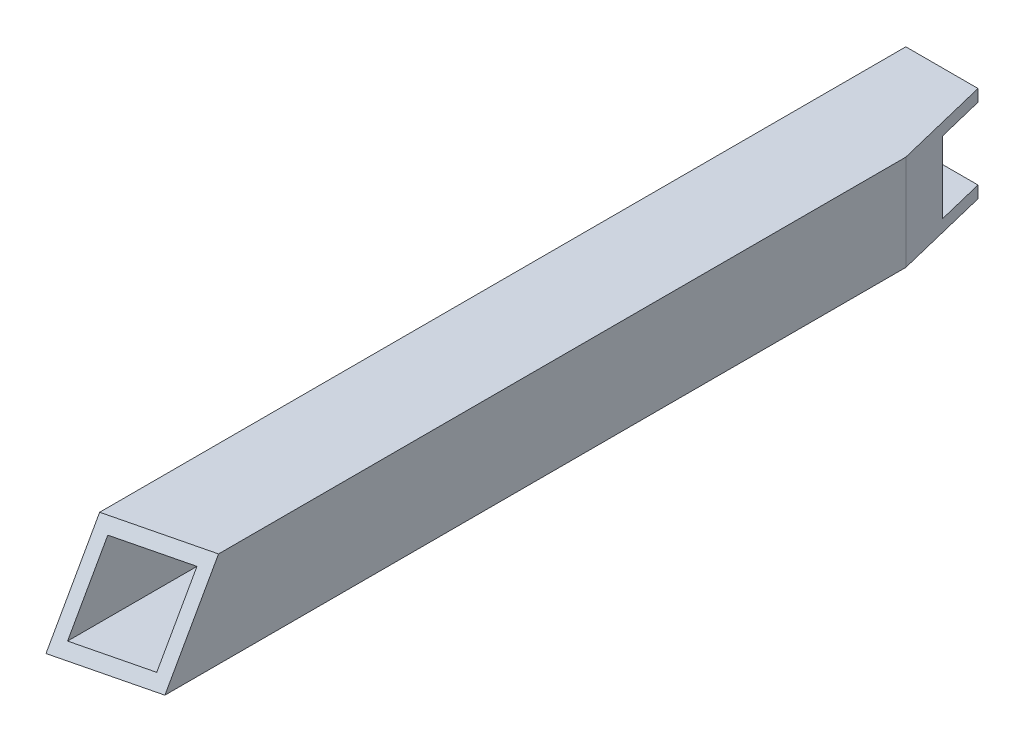
ISO-10303-21;
HEADER;
FILE_DESCRIPTION(('STEP AP214'),'2;1');
FILE_NAME('part.step','',(''),(''),'','','');
FILE_SCHEMA(('AUTOMOTIVE_DESIGN { 1 0 10303 214 1 1 1 1 }'));
ENDSEC;
DATA;
#1=APPLICATION_CONTEXT('core data for automotive mechanical design processes');
#2=APPLICATION_PROTOCOL_DEFINITION('international standard','automotive_design',2000,#1);
#3=PRODUCT_CONTEXT('',#1,'mechanical');
#4=PRODUCT('Part','Part','',(#3));
#5=PRODUCT_RELATED_PRODUCT_CATEGORY('part','',(#4));
#6=PRODUCT_DEFINITION_FORMATION('','',#4);
#7=PRODUCT_DEFINITION_CONTEXT('part definition',#1,'design');
#8=PRODUCT_DEFINITION('design','',#6,#7);
#9=PRODUCT_DEFINITION_SHAPE('','',#8);
#10=(LENGTH_UNIT() NAMED_UNIT(*) SI_UNIT(.MILLI.,.METRE.));
#11=(NAMED_UNIT(*) PLANE_ANGLE_UNIT() SI_UNIT($,.RADIAN.));
#12=(NAMED_UNIT(*) SI_UNIT($,.STERADIAN.) SOLID_ANGLE_UNIT());
#13=UNCERTAINTY_MEASURE_WITH_UNIT(LENGTH_MEASURE(1.E-05),#10,'distance_accuracy_value','');
#14=(GEOMETRIC_REPRESENTATION_CONTEXT(3) GLOBAL_UNCERTAINTY_ASSIGNED_CONTEXT((#13)) GLOBAL_UNIT_ASSIGNED_CONTEXT((#10,
#11,#12)) REPRESENTATION_CONTEXT('',''));
#15=CARTESIAN_POINT('',(0.,0.,0.));
#16=DIRECTION('',(0.,0.,1.));
#17=DIRECTION('',(1.,0.,0.));
#18=AXIS2_PLACEMENT_3D('',#15,#16,#17);
#19=CARTESIAN_POINT('',(12.7,-12.7,114.3));
#20=DIRECTION('',(0.,1.,0.));
#21=DIRECTION('',(0.,0.,1.));
#22=AXIS2_PLACEMENT_3D('',#19,#20,#21);
#23=PLANE('',#22);
#24=DIRECTION('',(-0.237550265071459,0.,-0.971375247556));
#25=VECTOR('',#24,1.);
#26=CARTESIAN_POINT('',(59.5884909402868,-12.7,102.833397901902));
#27=LINE('',#26,#25);
#28=CARTESIAN_POINT('',(12.7,-12.7,-88.9));
#29=VERTEX_POINT('',#28);
#30=CARTESIAN_POINT('',(6.48841827811019,-12.7,-114.3));
#31=VERTEX_POINT('',#30);
#32=EDGE_CURVE('E57',#29,#31,#27,.T.);
#33=ORIENTED_EDGE('',*,*,#32,.F.);
#34=DIRECTION('',(0.,0.,-1.));
#35=VECTOR('',#34,1.);
#36=CARTESIAN_POINT('',(12.7,-12.7,114.3));
#37=LINE('',#36,#35);
#38=CARTESIAN_POINT('',(12.7,-12.7,108.08841827811));
#39=VERTEX_POINT('',#38);
#40=EDGE_CURVE('E157',#39,#29,#37,.T.);
#41=ORIENTED_EDGE('',*,*,#40,.F.);
#42=DIRECTION('',(0.971375247556,0.,-0.237550265071459));
#43=VECTOR('',#42,1.);
#44=CARTESIAN_POINT('',(11.2666747377378,-12.7,108.438938632464));
#45=LINE('',#44,#43);
#46=CARTESIAN_POINT('',(-12.7,-12.7,114.3));
#47=VERTEX_POINT('',#46);
#48=EDGE_CURVE('E199',#47,#39,#45,.T.);
#49=ORIENTED_EDGE('',*,*,#48,.F.);
#50=DIRECTION('',(0.,0.,-1.));
#51=VECTOR('',#50,1.);
#52=CARTESIAN_POINT('',(-12.7,-12.7,114.3));
#53=LINE('',#52,#51);
#54=CARTESIAN_POINT('',(-12.7,-12.7,-114.3));
#55=VERTEX_POINT('',#54);
#56=EDGE_CURVE('E151',#47,#55,#53,.T.);
#57=ORIENTED_EDGE('',*,*,#56,.T.);
#58=DIRECTION('',(1.,0.,0.));
#59=VECTOR('',#58,1.);
#60=CARTESIAN_POINT('',(12.7,-12.7,-114.3));
#61=LINE('',#60,#59);
#62=EDGE_CURVE('E133',#55,#31,#61,.T.);
#63=ORIENTED_EDGE('',*,*,#62,.T.);
#64=EDGE_LOOP('',(#33,#41,#49,#57,#63));
#65=FACE_BOUND('',#64,.T.);
#66=ADVANCED_FACE('F41',(#65),#23,.F.);
#67=CARTESIAN_POINT('',(12.7,-12.7,114.3));
#68=DIRECTION('',(-1.,0.,0.));
#69=DIRECTION('',(0.,0.,1.));
#70=AXIS2_PLACEMENT_3D('',#67,#68,#69);
#71=PLANE('',#70);
#72=DIRECTION('',(0.,-1.,0.));
#73=VECTOR('',#72,1.);
#74=CARTESIAN_POINT('',(12.7,-12.7,-88.9));
#75=LINE('',#74,#73);
#76=CARTESIAN_POINT('',(12.7,12.7,-88.9));
#77=VERTEX_POINT('',#76);
#78=EDGE_CURVE('E64',#77,#29,#75,.T.);
#79=ORIENTED_EDGE('',*,*,#78,.F.);
#80=DIRECTION('',(0.,0.,-1.));
#81=VECTOR('',#80,1.);
#82=CARTESIAN_POINT('',(12.7,12.7,114.3));
#83=LINE('',#82,#81);
#84=CARTESIAN_POINT('',(12.7,12.7,93.8258754690913));
#85=VERTEX_POINT('',#84);
#86=EDGE_CURVE('E138',#85,#77,#83,.T.);
#87=ORIENTED_EDGE('',*,*,#86,.F.);
#88=DIRECTION('',(0.,0.871941379078781,-0.489610285278194));
#89=VECTOR('',#88,1.);
#90=CARTESIAN_POINT('',(12.7,-15.3517954674975,109.57744766299));
#91=LINE('',#90,#89);
#92=EDGE_CURVE('E203',#39,#85,#91,.T.);
#93=ORIENTED_EDGE('',*,*,#92,.F.);
#94=ORIENTED_EDGE('',*,*,#40,.T.);
#95=EDGE_LOOP('',(#79,#87,#93,#94));
#96=FACE_BOUND('',#95,.T.);
#97=ADVANCED_FACE('F251',(#96),#71,.F.);
#98=CARTESIAN_POINT('',(12.7,12.7,114.3));
#99=DIRECTION('',(0.,-1.,0.));
#100=DIRECTION('',(0.,0.,-1.));
#101=AXIS2_PLACEMENT_3D('',#98,#99,#100);
#102=PLANE('',#101);
#103=DIRECTION('',(0.237550265071459,0.,0.971375247556));
#104=VECTOR('',#103,1.);
#105=CARTESIAN_POINT('',(59.5884909402868,12.7,102.833397901902));
#106=LINE('',#105,#104);
#107=CARTESIAN_POINT('',(6.48841827811019,12.7,-114.3));
#108=VERTEX_POINT('',#107);
#109=EDGE_CURVE('E136',#108,#77,#106,.T.);
#110=ORIENTED_EDGE('',*,*,#109,.F.);
#111=DIRECTION('',(-1.,0.,0.));
#112=VECTOR('',#111,1.);
#113=CARTESIAN_POINT('',(12.7,12.7,-114.3));
#114=LINE('',#113,#112);
#115=CARTESIAN_POINT('',(-12.7,12.7,-114.3));
#116=VERTEX_POINT('',#115);
#117=EDGE_CURVE('E121',#108,#116,#114,.T.);
#118=ORIENTED_EDGE('',*,*,#117,.T.);
#119=DIRECTION('',(0.,0.,-1.));
#120=VECTOR('',#119,1.);
#121=CARTESIAN_POINT('',(-12.7,12.7,114.3));
#122=LINE('',#121,#120);
#123=CARTESIAN_POINT('',(-12.7,12.7,100.037457190981));
#124=VERTEX_POINT('',#123);
#125=EDGE_CURVE('E164',#124,#116,#122,.T.);
#126=ORIENTED_EDGE('',*,*,#125,.F.);
#127=DIRECTION('',(-0.971375247556,0.,0.237550265071459));
#128=VECTOR('',#127,1.);
#129=CARTESIAN_POINT('',(7.97558660148711,12.7,94.9812329459753));
#130=LINE('',#129,#128);
#131=EDGE_CURVE('E207',#85,#124,#130,.T.);
#132=ORIENTED_EDGE('',*,*,#131,.F.);
#133=ORIENTED_EDGE('',*,*,#86,.T.);
#134=EDGE_LOOP('',(#110,#118,#126,#132,#133));
#135=FACE_BOUND('',#134,.T.);
#136=ADVANCED_FACE('F137',(#135),#102,.F.);
#137=CARTESIAN_POINT('',(9.525,-9.525,114.3));
#138=DIRECTION('',(0.,1.,0.));
#139=DIRECTION('',(0.,0.,1.));
#140=AXIS2_PLACEMENT_3D('',#137,#138,#139);
#141=PLANE('',#140);
#142=DIRECTION('',(0.,0.,-1.));
#143=VECTOR('',#142,1.);
#144=CARTESIAN_POINT('',(9.525,-9.525,114.3));
#145=LINE('',#144,#143);
#146=CARTESIAN_POINT('',(9.525,-9.525,107.082048142219));
#147=VERTEX_POINT('',#146);
#148=CARTESIAN_POINT('',(9.525,-9.525,-101.883005554898));
#149=VERTEX_POINT('',#148);
#150=EDGE_CURVE('E170',#147,#149,#145,.T.);
#151=ORIENTED_EDGE('',*,*,#150,.T.);
#152=DIRECTION('',(-0.237550265071459,0.,-0.971375247556));
#153=VECTOR('',#152,1.);
#154=CARTESIAN_POINT('',(59.409325282504,-9.525,102.10076523096));
#155=LINE('',#154,#153);
#156=CARTESIAN_POINT('',(6.48841827811019,-9.525,-114.3));
#157=VERTEX_POINT('',#156);
#158=EDGE_CURVE('E141',#149,#157,#155,.T.);
#159=ORIENTED_EDGE('',*,*,#158,.T.);
#160=DIRECTION('',(1.,0.,0.));
#161=VECTOR('',#160,1.);
#162=CARTESIAN_POINT('',(9.525,-9.525,-114.3));
#163=LINE('',#162,#161);
#164=CARTESIAN_POINT('',(-9.52499999999999,-9.525,-114.3));
#165=VERTEX_POINT('',#164);
#166=EDGE_CURVE('E187',#165,#157,#163,.T.);
#167=ORIENTED_EDGE('',*,*,#166,.F.);
#168=DIRECTION('',(0.,0.,-1.));
#169=VECTOR('',#168,1.);
#170=CARTESIAN_POINT('',(-9.52499999999999,-9.525,114.3));
#171=LINE('',#170,#169);
#172=CARTESIAN_POINT('',(-9.52499999999999,-9.525,111.740734433636));
#173=VERTEX_POINT('',#172);
#174=EDGE_CURVE('E167',#173,#165,#171,.T.);
#175=ORIENTED_EDGE('',*,*,#174,.F.);
#176=DIRECTION('',(0.971375247556,0.,-0.237550265071459));
#177=VECTOR('',#176,1.);
#178=CARTESIAN_POINT('',(7.85945437848923,-9.525,107.489358092595));
#179=LINE('',#178,#177);
#180=EDGE_CURVE('E215',#173,#147,#179,.T.);
#181=ORIENTED_EDGE('',*,*,#180,.T.);
#182=EDGE_LOOP('',(#151,#159,#167,#175,#181));
#183=FACE_BOUND('',#182,.T.);
#184=ADVANCED_FACE('F240',(#183),#141,.T.);
#185=CARTESIAN_POINT('',(9.525,-9.525,114.3));
#186=DIRECTION('',(-1.,0.,0.));
#187=DIRECTION('',(0.,0.,1.));
#188=AXIS2_PLACEMENT_3D('',#185,#186,#187);
#189=PLANE('',#188);
#190=DIRECTION('',(0.,0.,-1.));
#191=VECTOR('',#190,1.);
#192=CARTESIAN_POINT('',(9.525,9.525,114.3));
#193=LINE('',#192,#191);
#194=CARTESIAN_POINT('',(9.525,9.525,96.3851410354549));
#195=VERTEX_POINT('',#194);
#196=CARTESIAN_POINT('',(9.525,9.525,-101.883005554898));
#197=VERTEX_POINT('',#196);
#198=EDGE_CURVE('E174',#195,#197,#193,.T.);
#199=ORIENTED_EDGE('',*,*,#198,.T.);
#200=DIRECTION('',(0.,-1.,0.));
#201=VECTOR('',#200,1.);
#202=CARTESIAN_POINT('',(9.525,-9.525,-101.883005554898));
#203=LINE('',#202,#201);
#204=EDGE_CURVE('E229',#197,#149,#203,.T.);
#205=ORIENTED_EDGE('',*,*,#204,.T.);
#206=ORIENTED_EDGE('',*,*,#150,.F.);
#207=DIRECTION('',(0.,0.871941379078781,-0.489610285278194));
#208=VECTOR('',#207,1.);
#209=CARTESIAN_POINT('',(9.525,-12.6064264189147,108.812322796259));
#210=LINE('',#209,#208);
#211=EDGE_CURVE('E219',#147,#195,#210,.T.);
#212=ORIENTED_EDGE('',*,*,#211,.T.);
#213=EDGE_LOOP('',(#199,#205,#206,#212));
#214=FACE_BOUND('',#213,.T.);
#215=ADVANCED_FACE('F235',(#214),#189,.T.);
#216=CARTESIAN_POINT('',(9.525,9.525,114.3));
#217=DIRECTION('',(0.,-1.,0.));
#218=DIRECTION('',(0.,0.,-1.));
#219=AXIS2_PLACEMENT_3D('',#216,#217,#218);
#220=PLANE('',#219);
#221=DIRECTION('',(-1.,0.,0.));
#222=VECTOR('',#221,1.);
#223=CARTESIAN_POINT('',(9.525,9.525,-114.3));
#224=LINE('',#223,#222);
#225=CARTESIAN_POINT('',(6.48841827811019,9.525,-114.3));
#226=VERTEX_POINT('',#225);
#227=CARTESIAN_POINT('',(-9.52499999999999,9.525,-114.3));
#228=VERTEX_POINT('',#227);
#229=EDGE_CURVE('E184',#226,#228,#224,.T.);
#230=ORIENTED_EDGE('',*,*,#229,.F.);
#231=DIRECTION('',(0.237550265071459,0.,0.971375247556));
#232=VECTOR('',#231,1.);
#233=CARTESIAN_POINT('',(59.409325282504,9.525,102.10076523096));
#234=LINE('',#233,#232);
#235=EDGE_CURVE('E146',#226,#197,#234,.T.);
#236=ORIENTED_EDGE('',*,*,#235,.T.);
#237=ORIENTED_EDGE('',*,*,#198,.F.);
#238=DIRECTION('',(-0.971375247556,0.,0.237550265071459));
#239=VECTOR('',#238,1.);
#240=CARTESIAN_POINT('',(5.39113827630122,9.525,97.3960788277284));
#241=LINE('',#240,#239);
#242=CARTESIAN_POINT('',(-9.52499999999999,9.525,101.043827326872));
#243=VERTEX_POINT('',#242);
#244=EDGE_CURVE('E148',#195,#243,#241,.T.);
#245=ORIENTED_EDGE('',*,*,#244,.T.);
#246=DIRECTION('',(0.,0.,-1.));
#247=VECTOR('',#246,1.);
#248=CARTESIAN_POINT('',(-9.52499999999999,9.525,114.3));
#249=LINE('',#248,#247);
#250=EDGE_CURVE('E132',#243,#228,#249,.T.);
#251=ORIENTED_EDGE('',*,*,#250,.T.);
#252=EDGE_LOOP('',(#230,#236,#237,#245,#251));
#253=FACE_BOUND('',#252,.T.);
#254=ADVANCED_FACE('F233',(#253),#220,.T.);
#255=CARTESIAN_POINT('',(0.,0.,-114.3));
#256=DIRECTION('',(0.,0.,1.));
#257=DIRECTION('',(1.,0.,0.));
#258=AXIS2_PLACEMENT_3D('',#255,#256,#257);
#259=PLANE('',#258);
#260=DIRECTION('',(0.,1.,0.));
#261=VECTOR('',#260,1.);
#262=CARTESIAN_POINT('',(6.48841827811019,0.,-114.3));
#263=LINE('',#262,#261);
#264=EDGE_CURVE('E12',#31,#157,#263,.T.);
#265=ORIENTED_EDGE('',*,*,#264,.F.);
#266=ORIENTED_EDGE('',*,*,#62,.F.);
#267=DIRECTION('',(0.,-1.,0.));
#268=VECTOR('',#267,1.);
#269=CARTESIAN_POINT('',(-12.7,-12.7,-114.3));
#270=LINE('',#269,#268);
#271=EDGE_CURVE('E128',#116,#55,#270,.T.);
#272=ORIENTED_EDGE('',*,*,#271,.F.);
#273=ORIENTED_EDGE('',*,*,#117,.F.);
#274=EDGE_CURVE('E45',#226,#108,#263,.T.);
#275=ORIENTED_EDGE('',*,*,#274,.F.);
#276=ORIENTED_EDGE('',*,*,#229,.T.);
#277=DIRECTION('',(0.,-1.,0.));
#278=VECTOR('',#277,1.);
#279=CARTESIAN_POINT('',(-9.52499999999999,-9.525,-114.3));
#280=LINE('',#279,#278);
#281=EDGE_CURVE('E191',#228,#165,#280,.T.);
#282=ORIENTED_EDGE('',*,*,#281,.T.);
#283=ORIENTED_EDGE('',*,*,#166,.T.);
#284=EDGE_LOOP('',(#265,#266,#272,#273,#275,#276,#282,#283));
#285=FACE_BOUND('',#284,.T.);
#286=ADVANCED_FACE('F123',(#285),#259,.F.);
#287=CARTESIAN_POINT('',(-12.7,-12.7,114.3));
#288=DIRECTION('',(1.,0.,0.));
#289=DIRECTION('',(0.,0.,-1.));
#290=AXIS2_PLACEMENT_3D('',#287,#288,#289);
#291=PLANE('',#290);
#292=DIRECTION('',(0.,-0.871941379078781,0.489610285278194));
#293=VECTOR('',#292,1.);
#294=CARTESIAN_POINT('',(-12.7,-12.7,114.3));
#295=LINE('',#294,#293);
#296=EDGE_CURVE('E195',#124,#47,#295,.T.);
#297=ORIENTED_EDGE('',*,*,#296,.F.);
#298=ORIENTED_EDGE('',*,*,#125,.T.);
#299=ORIENTED_EDGE('',*,*,#271,.T.);
#300=ORIENTED_EDGE('',*,*,#56,.F.);
#301=EDGE_LOOP('',(#297,#298,#299,#300));
#302=FACE_BOUND('',#301,.T.);
#303=ADVANCED_FACE('F43',(#302),#291,.F.);
#304=CARTESIAN_POINT('',(-9.52499999999999,-9.525,114.3));
#305=DIRECTION('',(1.,0.,0.));
#306=DIRECTION('',(0.,0.,-1.));
#307=AXIS2_PLACEMENT_3D('',#304,#305,#306);
#308=PLANE('',#307);
#309=ORIENTED_EDGE('',*,*,#250,.F.);
#310=DIRECTION('',(0.,-0.871941379078781,0.489610285278194));
#311=VECTOR('',#310,1.);
#312=CARTESIAN_POINT('',(-9.52499999999999,-10.6175798182915,112.354237049016));
#313=LINE('',#312,#311);
#314=EDGE_CURVE('E211',#243,#173,#313,.T.);
#315=ORIENTED_EDGE('',*,*,#314,.T.);
#316=ORIENTED_EDGE('',*,*,#174,.T.);
#317=ORIENTED_EDGE('',*,*,#281,.F.);
#318=EDGE_LOOP('',(#309,#315,#316,#317));
#319=FACE_BOUND('',#318,.T.);
#320=ADVANCED_FACE('F244',(#319),#308,.T.);
#321=CARTESIAN_POINT('',(18.5066645417676,42.493539825603,75.6762609601282));
#322=DIRECTION('',(0.208545238636166,0.478845087585913,0.852769761153047));
#323=DIRECTION('',(0.,-0.871941379078781,0.489610285278194));
#324=AXIS2_PLACEMENT_3D('',#321,#322,#323);
#325=PLANE('',#324);
#326=ORIENTED_EDGE('',*,*,#314,.F.);
#327=ORIENTED_EDGE('',*,*,#244,.F.);
#328=ORIENTED_EDGE('',*,*,#211,.F.);
#329=ORIENTED_EDGE('',*,*,#180,.F.);
#330=EDGE_LOOP('',(#326,#327,#328,#329));
#331=FACE_BOUND('',#330,.T.);
#332=ORIENTED_EDGE('',*,*,#131,.T.);
#333=ORIENTED_EDGE('',*,*,#296,.T.);
#334=ORIENTED_EDGE('',*,*,#48,.T.);
#335=ORIENTED_EDGE('',*,*,#92,.T.);
#336=EDGE_LOOP('',(#332,#333,#334,#335));
#337=FACE_BOUND('',#336,.T.);
#338=ADVANCED_FACE('F246',(#331,#337),#325,.T.);
#339=CARTESIAN_POINT('',(32.4970521552444,0.,-7.94716910168567));
#340=DIRECTION('',(0.971375247556,0.,-0.237550265071459));
#341=DIRECTION('',(-0.237550265071459,0.,-0.971375247556));
#342=AXIS2_PLACEMENT_3D('',#339,#340,#341);
#343=PLANE('',#342);
#344=ORIENTED_EDGE('',*,*,#32,.T.);
#345=ORIENTED_EDGE('',*,*,#264,.T.);
#346=ORIENTED_EDGE('',*,*,#158,.F.);
#347=ORIENTED_EDGE('',*,*,#204,.F.);
#348=ORIENTED_EDGE('',*,*,#235,.F.);
#349=ORIENTED_EDGE('',*,*,#274,.T.);
#350=ORIENTED_EDGE('',*,*,#109,.T.);
#351=ORIENTED_EDGE('',*,*,#78,.T.);
#352=EDGE_LOOP('',(#344,#345,#346,#347,#348,#349,#350,#351));
#353=FACE_BOUND('',#352,.T.);
#354=ADVANCED_FACE('F144',(#353),#343,.T.);
#355=CLOSED_SHELL('',(#66,#97,#136,#184,#215,#254,#286,#303,#320,#338,#354));
#356=MANIFOLD_SOLID_BREP('B2',#355);
#357=ADVANCED_BREP_SHAPE_REPRESENTATION('',(#18,#356),#14);
#358=SHAPE_DEFINITION_REPRESENTATION(#9,#357);
ENDSEC;
END-ISO-10303-21;
